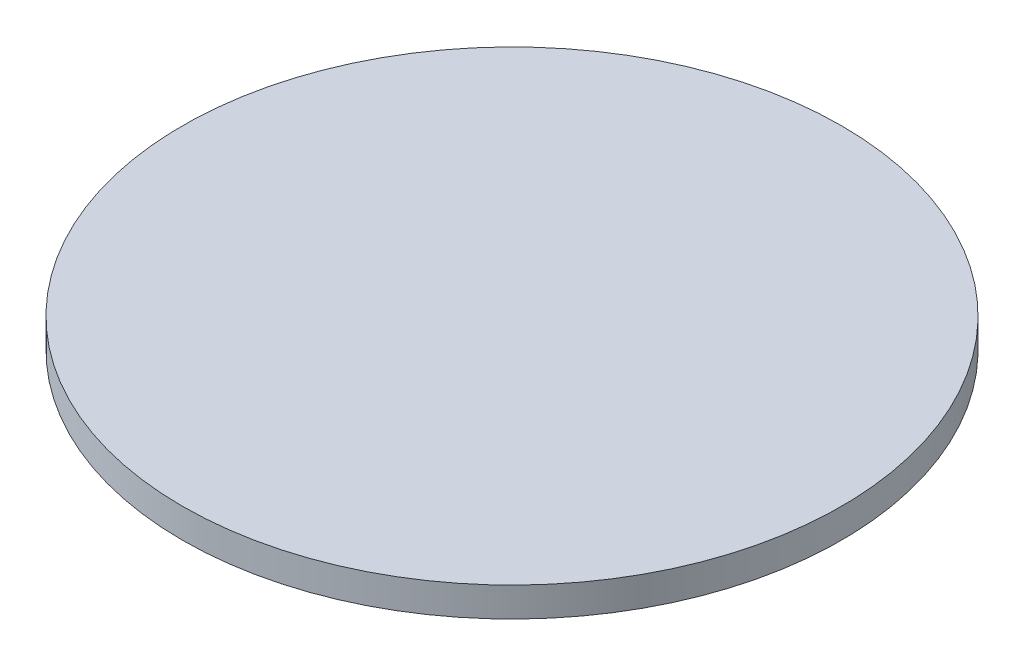
ISO-10303-21;
HEADER;
FILE_DESCRIPTION(('STEP AP214'),'2;1');
FILE_NAME('part.step','',(''),(''),'','','');
FILE_SCHEMA(('AUTOMOTIVE_DESIGN { 1 0 10303 214 1 1 1 1 }'));
ENDSEC;
DATA;
#1=APPLICATION_CONTEXT('core data for automotive mechanical design processes');
#2=APPLICATION_PROTOCOL_DEFINITION('international standard','automotive_design',2000,#1);
#3=PRODUCT_CONTEXT('',#1,'mechanical');
#4=PRODUCT('Part','Part','',(#3));
#5=PRODUCT_RELATED_PRODUCT_CATEGORY('part','',(#4));
#6=PRODUCT_DEFINITION_FORMATION('','',#4);
#7=PRODUCT_DEFINITION_CONTEXT('part definition',#1,'design');
#8=PRODUCT_DEFINITION('design','',#6,#7);
#9=PRODUCT_DEFINITION_SHAPE('','',#8);
#10=(LENGTH_UNIT() NAMED_UNIT(*) SI_UNIT(.MILLI.,.METRE.));
#11=(NAMED_UNIT(*) PLANE_ANGLE_UNIT() SI_UNIT($,.RADIAN.));
#12=(NAMED_UNIT(*) SI_UNIT($,.STERADIAN.) SOLID_ANGLE_UNIT());
#13=UNCERTAINTY_MEASURE_WITH_UNIT(LENGTH_MEASURE(1.E-05),#10,'distance_accuracy_value','');
#14=(GEOMETRIC_REPRESENTATION_CONTEXT(3) GLOBAL_UNCERTAINTY_ASSIGNED_CONTEXT((#13)) GLOBAL_UNIT_ASSIGNED_CONTEXT((#10,
#11,#12)) REPRESENTATION_CONTEXT('',''));
#15=CARTESIAN_POINT('',(0.,0.,0.));
#16=DIRECTION('',(0.,0.,1.));
#17=DIRECTION('',(1.,0.,0.));
#18=AXIS2_PLACEMENT_3D('',#15,#16,#17);
#19=CARTESIAN_POINT('',(0.,95.25,0.));
#20=DIRECTION('',(0.,-1.,0.));
#21=DIRECTION('',(0.,0.,-1.));
#22=AXIS2_PLACEMENT_3D('',#19,#20,#21);
#23=CYLINDRICAL_SURFACE('',#22,1066.8);
#24=CARTESIAN_POINT('',(0.,95.25,0.));
#25=DIRECTION('',(0.,1.,0.));
#26=DIRECTION('',(0.,0.,1.));
#27=AXIS2_PLACEMENT_3D('',#24,#25,#26);
#28=CIRCLE('',#27,1066.8);
#29=CARTESIAN_POINT('',(0.,95.25,1066.8));
#30=VERTEX_POINT('',#29);
#31=EDGE_CURVE('E10',#30,#30,#28,.T.);
#32=ORIENTED_EDGE('',*,*,#31,.F.);
#33=EDGE_LOOP('',(#32));
#34=FACE_BOUND('',#33,.T.);
#35=CARTESIAN_POINT('',(0.,0.,0.));
#36=DIRECTION('',(0.,1.,0.));
#37=DIRECTION('',(0.,0.,1.));
#38=AXIS2_PLACEMENT_3D('',#35,#36,#37);
#39=CIRCLE('',#38,1066.8);
#40=CARTESIAN_POINT('',(0.,0.,1066.8));
#41=VERTEX_POINT('',#40);
#42=EDGE_CURVE('E40',#41,#41,#39,.T.);
#43=ORIENTED_EDGE('',*,*,#42,.T.);
#44=EDGE_LOOP('',(#43));
#45=FACE_BOUND('',#44,.T.);
#46=ADVANCED_FACE('F37',(#34,#45),#23,.T.);
#47=CARTESIAN_POINT('',(0.,95.25,0.));
#48=DIRECTION('',(0.,1.,0.));
#49=DIRECTION('',(0.,0.,1.));
#50=AXIS2_PLACEMENT_3D('',#47,#48,#49);
#51=PLANE('',#50);
#52=ORIENTED_EDGE('',*,*,#31,.T.);
#53=EDGE_LOOP('',(#52));
#54=FACE_BOUND('',#53,.T.);
#55=ADVANCED_FACE('F52',(#54),#51,.T.);
#56=CARTESIAN_POINT('',(0.,0.,0.));
#57=DIRECTION('',(0.,1.,0.));
#58=DIRECTION('',(0.,0.,1.));
#59=AXIS2_PLACEMENT_3D('',#56,#57,#58);
#60=PLANE('',#59);
#61=ORIENTED_EDGE('',*,*,#42,.F.);
#62=EDGE_LOOP('',(#61));
#63=FACE_BOUND('',#62,.T.);
#64=ADVANCED_FACE('F50',(#63),#60,.F.);
#65=CLOSED_SHELL('',(#46,#55,#64));
#66=MANIFOLD_SOLID_BREP('B2',#65);
#67=ADVANCED_BREP_SHAPE_REPRESENTATION('',(#18,#66),#14);
#68=SHAPE_DEFINITION_REPRESENTATION(#9,#67);
ENDSEC;
END-ISO-10303-21;
